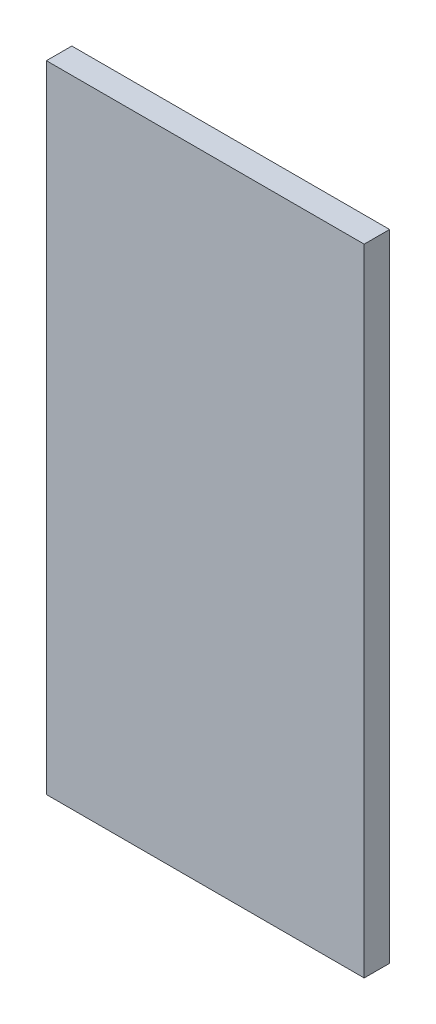
ISO-10303-21;
HEADER;
FILE_DESCRIPTION(('STEP AP214'),'2;1');
FILE_NAME('part.step','',(''),(''),'','','');
FILE_SCHEMA(('AUTOMOTIVE_DESIGN { 1 0 10303 214 1 1 1 1 }'));
ENDSEC;
DATA;
#1=APPLICATION_CONTEXT('core data for automotive mechanical design processes');
#2=APPLICATION_PROTOCOL_DEFINITION('international standard','automotive_design',2000,#1);
#3=PRODUCT_CONTEXT('',#1,'mechanical');
#4=PRODUCT('Part','Part','',(#3));
#5=PRODUCT_RELATED_PRODUCT_CATEGORY('part','',(#4));
#6=PRODUCT_DEFINITION_FORMATION('','',#4);
#7=PRODUCT_DEFINITION_CONTEXT('part definition',#1,'design');
#8=PRODUCT_DEFINITION('design','',#6,#7);
#9=PRODUCT_DEFINITION_SHAPE('','',#8);
#10=(LENGTH_UNIT() NAMED_UNIT(*) SI_UNIT(.MILLI.,.METRE.));
#11=(NAMED_UNIT(*) PLANE_ANGLE_UNIT() SI_UNIT($,.RADIAN.));
#12=(NAMED_UNIT(*) SI_UNIT($,.STERADIAN.) SOLID_ANGLE_UNIT());
#13=UNCERTAINTY_MEASURE_WITH_UNIT(LENGTH_MEASURE(1.E-05),#10,'distance_accuracy_value','');
#14=(GEOMETRIC_REPRESENTATION_CONTEXT(3) GLOBAL_UNCERTAINTY_ASSIGNED_CONTEXT((#13)) GLOBAL_UNIT_ASSIGNED_CONTEXT((#10,
#11,#12)) REPRESENTATION_CONTEXT('',''));
#15=CARTESIAN_POINT('',(0.,0.,0.));
#16=DIRECTION('',(0.,0.,1.));
#17=DIRECTION('',(1.,0.,0.));
#18=AXIS2_PLACEMENT_3D('',#15,#16,#17);
#19=CARTESIAN_POINT('',(0.,0.,7.));
#20=DIRECTION('',(0.,0.,-1.));
#21=DIRECTION('',(-1.,0.,0.));
#22=AXIS2_PLACEMENT_3D('',#19,#20,#21);
#23=TOROIDAL_SURFACE('',#22,41.,1.);
#24=CARTESIAN_POINT('',(0.,0.,8.));
#25=DIRECTION('',(0.,0.,-1.));
#26=DIRECTION('',(-1.,0.,0.));
#27=AXIS2_PLACEMENT_3D('',#24,#25,#26);
#28=CIRCLE('',#27,41.);
#29=CARTESIAN_POINT('',(-41.,0.,8.));
#30=VERTEX_POINT('',#29);
#31=EDGE_CURVE('E45',#30,#30,#28,.F.);
#32=ORIENTED_EDGE('',*,*,#31,.F.);
#33=EDGE_LOOP('',(#32));
#34=FACE_BOUND('',#33,.T.);
#35=CARTESIAN_POINT('',(0.,0.,7.));
#36=DIRECTION('',(0.,0.,-1.));
#37=DIRECTION('',(-1.,0.,0.));
#38=AXIS2_PLACEMENT_3D('',#35,#36,#37);
#39=CIRCLE('',#38,40.);
#40=CARTESIAN_POINT('',(-40.,0.,7.));
#41=VERTEX_POINT('',#40);
#42=EDGE_CURVE('E11',#41,#41,#39,.T.);
#43=ORIENTED_EDGE('',*,*,#42,.F.);
#44=EDGE_LOOP('',(#43));
#45=FACE_BOUND('',#44,.T.);
#46=ADVANCED_FACE('F37',(#34,#45),#23,.F.);
#47=CARTESIAN_POINT('',(0.,0.,1.5));
#48=DIRECTION('',(0.,0.,-1.));
#49=DIRECTION('',(-1.,0.,0.));
#50=AXIS2_PLACEMENT_3D('',#47,#48,#49);
#51=CYLINDRICAL_SURFACE('',#50,17.5);
#52=CARTESIAN_POINT('',(0.,0.,1.5));
#53=DIRECTION('',(0.,0.,1.));
#54=DIRECTION('',(1.,0.,0.));
#55=AXIS2_PLACEMENT_3D('',#52,#53,#54);
#56=CIRCLE('',#55,17.5);
#57=CARTESIAN_POINT('',(17.5,0.,1.5));
#58=VERTEX_POINT('',#57);
#59=EDGE_CURVE('E119',#58,#58,#56,.T.);
#60=ORIENTED_EDGE('',*,*,#59,.F.);
#61=EDGE_LOOP('',(#60));
#62=FACE_BOUND('',#61,.T.);
#63=CARTESIAN_POINT('',(0.,0.,0.));
#64=DIRECTION('',(0.,0.,1.));
#65=DIRECTION('',(1.,0.,0.));
#66=AXIS2_PLACEMENT_3D('',#63,#64,#65);
#67=CIRCLE('',#66,17.5);
#68=CARTESIAN_POINT('',(17.5,0.,0.));
#69=VERTEX_POINT('',#68);
#70=EDGE_CURVE('E118',#69,#69,#67,.T.);
#71=ORIENTED_EDGE('',*,*,#70,.T.);
#72=EDGE_LOOP('',(#71));
#73=FACE_BOUND('',#72,.T.);
#74=ADVANCED_FACE('F131',(#62,#73),#51,.T.);
#75=CARTESIAN_POINT('',(0.,0.,0.));
#76=DIRECTION('',(0.,0.,1.));
#77=DIRECTION('',(1.,0.,0.));
#78=AXIS2_PLACEMENT_3D('',#75,#76,#77);
#79=PLANE('',#78);
#80=ORIENTED_EDGE('',*,*,#70,.F.);
#81=EDGE_LOOP('',(#80));
#82=FACE_BOUND('',#81,.T.);
#83=ADVANCED_FACE('F138',(#82),#79,.F.);
#84=CARTESIAN_POINT('',(0.,0.,8.));
#85=DIRECTION('',(0.,0.,-1.));
#86=DIRECTION('',(-1.,0.,0.));
#87=AXIS2_PLACEMENT_3D('',#84,#85,#86);
#88=CYLINDRICAL_SURFACE('',#87,40.);
#89=CARTESIAN_POINT('',(0.,0.,1.5));
#90=DIRECTION('',(0.,0.,1.));
#91=DIRECTION('',(1.,0.,0.));
#92=AXIS2_PLACEMENT_3D('',#89,#90,#91);
#93=CIRCLE('',#92,40.);
#94=CARTESIAN_POINT('',(-40.,0.,1.5));
#95=VERTEX_POINT('',#94);
#96=EDGE_CURVE('E113',#95,#95,#93,.T.);
#97=CARTESIAN_POINT('',(-40.,0.,7.));
#98=CARTESIAN_POINT('',(-40.,0.,6.94270833333333));
#99=CARTESIAN_POINT('',(-40.,0.,6.88541666666667));
#100=CARTESIAN_POINT('',(-40.,0.,6.77083333333333));
#101=CARTESIAN_POINT('',(-40.,0.,6.71354166666667));
#102=CARTESIAN_POINT('',(-40.,0.,6.59895833333333));
#103=CARTESIAN_POINT('',(-40.,0.,6.54166666666667));
#104=CARTESIAN_POINT('',(-40.,0.,6.42708333333333));
#105=CARTESIAN_POINT('',(-40.,0.,6.36979166666667));
#106=CARTESIAN_POINT('',(-40.,0.,6.25520833333333));
#107=CARTESIAN_POINT('',(-40.,0.,6.19791666666667));
#108=CARTESIAN_POINT('',(-40.,0.,6.08333333333333));
#109=CARTESIAN_POINT('',(-40.,0.,6.02604166666667));
#110=CARTESIAN_POINT('',(-40.,0.,5.91145833333333));
#111=CARTESIAN_POINT('',(-40.,0.,5.85416666666667));
#112=CARTESIAN_POINT('',(-40.,0.,5.73958333333333));
#113=CARTESIAN_POINT('',(-40.,0.,5.68229166666667));
#114=CARTESIAN_POINT('',(-40.,0.,5.56770833333333));
#115=CARTESIAN_POINT('',(-40.,0.,5.51041666666667));
#116=CARTESIAN_POINT('',(-40.,0.,5.39583333333333));
#117=CARTESIAN_POINT('',(-40.,0.,5.33854166666667));
#118=CARTESIAN_POINT('',(-40.,0.,5.22395833333333));
#119=CARTESIAN_POINT('',(-40.,0.,5.16666666666667));
#120=CARTESIAN_POINT('',(-40.,0.,5.05208333333333));
#121=CARTESIAN_POINT('',(-40.,0.,4.99479166666667));
#122=CARTESIAN_POINT('',(-40.,0.,4.88020833333333));
#123=CARTESIAN_POINT('',(-40.,0.,4.82291666666667));
#124=CARTESIAN_POINT('',(-40.,0.,4.70833333333333));
#125=CARTESIAN_POINT('',(-40.,0.,4.65104166666667));
#126=CARTESIAN_POINT('',(-40.,0.,4.53645833333333));
#127=CARTESIAN_POINT('',(-40.,0.,4.47916666666667));
#128=CARTESIAN_POINT('',(-40.,0.,4.36458333333333));
#129=CARTESIAN_POINT('',(-40.,0.,4.30729166666667));
#130=CARTESIAN_POINT('',(-40.,0.,4.19270833333333));
#131=CARTESIAN_POINT('',(-40.,0.,4.13541666666667));
#132=CARTESIAN_POINT('',(-40.,0.,4.02083333333333));
#133=CARTESIAN_POINT('',(-40.,0.,3.96354166666667));
#134=CARTESIAN_POINT('',(-40.,0.,3.84895833333333));
#135=CARTESIAN_POINT('',(-40.,0.,3.79166666666667));
#136=CARTESIAN_POINT('',(-40.,0.,3.67708333333333));
#137=CARTESIAN_POINT('',(-40.,0.,3.61979166666667));
#138=CARTESIAN_POINT('',(-40.,0.,3.50520833333333));
#139=CARTESIAN_POINT('',(-40.,0.,3.44791666666667));
#140=CARTESIAN_POINT('',(-40.,0.,3.33333333333333));
#141=CARTESIAN_POINT('',(-40.,0.,3.27604166666667));
#142=CARTESIAN_POINT('',(-40.,0.,3.16145833333333));
#143=CARTESIAN_POINT('',(-40.,0.,3.10416666666667));
#144=CARTESIAN_POINT('',(-40.,0.,2.98958333333333));
#145=CARTESIAN_POINT('',(-40.,0.,2.93229166666667));
#146=CARTESIAN_POINT('',(-40.,0.,2.81770833333333));
#147=CARTESIAN_POINT('',(-40.,0.,2.76041666666667));
#148=CARTESIAN_POINT('',(-40.,0.,2.64583333333333));
#149=CARTESIAN_POINT('',(-40.,0.,2.58854166666667));
#150=CARTESIAN_POINT('',(-40.,0.,2.47395833333333));
#151=CARTESIAN_POINT('',(-40.,0.,2.41666666666667));
#152=CARTESIAN_POINT('',(-40.,0.,2.30208333333333));
#153=CARTESIAN_POINT('',(-40.,0.,2.24479166666667));
#154=CARTESIAN_POINT('',(-40.,0.,2.13020833333333));
#155=CARTESIAN_POINT('',(-40.,0.,2.07291666666667));
#156=CARTESIAN_POINT('',(-40.,0.,1.95833333333333));
#157=CARTESIAN_POINT('',(-40.,0.,1.90104166666667));
#158=CARTESIAN_POINT('',(-40.,0.,1.78645833333333));
#159=CARTESIAN_POINT('',(-40.,0.,1.72916666666667));
#160=CARTESIAN_POINT('',(-40.,0.,1.61458333333333));
#161=CARTESIAN_POINT('',(-40.,0.,1.55729166666667));
#162=CARTESIAN_POINT('',(-40.,0.,1.5));
#163=B_SPLINE_CURVE_WITH_KNOTS('',3,(#97,#98,#99,#100,#101,#102,#103,#104,#105,#106,#107,#108,
#109,#110,#111,#112,#113,#114,#115,#116,#117,#118,#119,#120,#121,#122,#123,#124,#125,#126,#127,
#128,#129,#130,#131,#132,#133,#134,#135,#136,#137,#138,#139,#140,#141,#142,#143,#144,#145,#146,
#147,#148,#149,#150,#151,#152,#153,#154,#155,#156,#157,#158,#159,#160,#161,#162),.UNSPECIFIED.,
.F.,.F.,(4,2,2,2,2,2,2,2,2,2,2,2,2,2,2,2,2,2,2,2,2,2,2,2,2,2,2,2,2,2,2,2,4),(0.,
0.171874999999999,0.343749999999999,0.515625,0.6875,0.859375,1.03125,1.203125,1.375,1.546875,
1.71875,1.890625,2.0625,2.234375,2.40625,2.578125,2.75,2.921875,3.09375,3.265625,3.4375,
3.609375,3.78125,3.953125,4.125,4.296875,4.46875,4.640625,4.8125,4.984375,5.15625,5.328125,5.5),.UNSPECIFIED.);
#164=EDGE_CURVE('BSEAM134',#41,#95,#163,.T.);
#165=ORIENTED_EDGE('',*,*,#42,.T.);
#166=ORIENTED_EDGE('',*,*,#96,.T.);
#167=ORIENTED_EDGE('',*,*,#164,.T.);
#168=ORIENTED_EDGE('',*,*,#164,.F.);
#169=EDGE_LOOP('',(#165,#167,#166,#168));
#170=FACE_BOUND('',#169,.T.);
#171=ADVANCED_FACE('F134',(#170),#88,.T.);
#172=CARTESIAN_POINT('',(0.,0.,1.5));
#173=DIRECTION('',(0.,0.,1.));
#174=DIRECTION('',(1.,0.,0.));
#175=AXIS2_PLACEMENT_3D('',#172,#173,#174);
#176=PLANE('',#175);
#177=ORIENTED_EDGE('',*,*,#59,.T.);
#178=EDGE_LOOP('',(#177));
#179=FACE_BOUND('',#178,.T.);
#180=ORIENTED_EDGE('',*,*,#96,.F.);
#181=EDGE_LOOP('',(#180));
#182=FACE_BOUND('',#181,.T.);
#183=ADVANCED_FACE('F137',(#179,#182),#176,.F.);
#184=CARTESIAN_POINT('',(-125.,-250.,28.));
#185=DIRECTION('',(-1.,0.,0.));
#186=DIRECTION('',(0.,0.,1.));
#187=AXIS2_PLACEMENT_3D('',#184,#185,#186);
#188=PLANE('',#187);
#189=DIRECTION('',(0.,1.,0.));
#190=VECTOR('',#189,1.);
#191=CARTESIAN_POINT('',(-125.,-250.,8.));
#192=LINE('',#191,#190);
#193=CARTESIAN_POINT('',(-125.,-250.,8.));
#194=VERTEX_POINT('',#193);
#195=CARTESIAN_POINT('',(-125.,250.,8.));
#196=VERTEX_POINT('',#195);
#197=EDGE_CURVE('E105',#194,#196,#192,.T.);
#198=ORIENTED_EDGE('',*,*,#197,.F.);
#199=DIRECTION('',(0.,0.,-1.));
#200=VECTOR('',#199,1.);
#201=CARTESIAN_POINT('',(-125.,-250.,28.));
#202=LINE('',#201,#200);
#203=CARTESIAN_POINT('',(-125.,-250.,28.));
#204=VERTEX_POINT('',#203);
#205=EDGE_CURVE('E53',#204,#194,#202,.T.);
#206=ORIENTED_EDGE('',*,*,#205,.F.);
#207=DIRECTION('',(0.,1.,0.));
#208=VECTOR('',#207,1.);
#209=CARTESIAN_POINT('',(-125.,-250.,28.));
#210=LINE('',#209,#208);
#211=CARTESIAN_POINT('',(-125.,250.,28.));
#212=VERTEX_POINT('',#211);
#213=EDGE_CURVE('E100',#204,#212,#210,.T.);
#214=ORIENTED_EDGE('',*,*,#213,.T.);
#215=DIRECTION('',(0.,0.,-1.));
#216=VECTOR('',#215,1.);
#217=CARTESIAN_POINT('',(-125.,250.,28.));
#218=LINE('',#217,#216);
#219=EDGE_CURVE('E78',#212,#196,#218,.T.);
#220=ORIENTED_EDGE('',*,*,#219,.T.);
#221=EDGE_LOOP('',(#198,#206,#214,#220));
#222=FACE_BOUND('',#221,.T.);
#223=ADVANCED_FACE('F143',(#222),#188,.T.);
#224=CARTESIAN_POINT('',(-125.,-250.,28.));
#225=DIRECTION('',(0.,1.,0.));
#226=DIRECTION('',(0.,0.,1.));
#227=AXIS2_PLACEMENT_3D('',#224,#225,#226);
#228=PLANE('',#227);
#229=DIRECTION('',(1.,0.,0.));
#230=VECTOR('',#229,1.);
#231=CARTESIAN_POINT('',(-125.,-250.,8.));
#232=LINE('',#231,#230);
#233=CARTESIAN_POINT('',(125.,-250.,8.));
#234=VERTEX_POINT('',#233);
#235=EDGE_CURVE('E70',#194,#234,#232,.T.);
#236=ORIENTED_EDGE('',*,*,#235,.T.);
#237=DIRECTION('',(0.,0.,-1.));
#238=VECTOR('',#237,1.);
#239=CARTESIAN_POINT('',(125.,-250.,28.));
#240=LINE('',#239,#238);
#241=CARTESIAN_POINT('',(125.,-250.,28.));
#242=VERTEX_POINT('',#241);
#243=EDGE_CURVE('E97',#242,#234,#240,.T.);
#244=ORIENTED_EDGE('',*,*,#243,.F.);
#245=DIRECTION('',(1.,0.,0.));
#246=VECTOR('',#245,1.);
#247=CARTESIAN_POINT('',(-125.,-250.,28.));
#248=LINE('',#247,#246);
#249=EDGE_CURVE('E88',#204,#242,#248,.T.);
#250=ORIENTED_EDGE('',*,*,#249,.F.);
#251=ORIENTED_EDGE('',*,*,#205,.T.);
#252=EDGE_LOOP('',(#236,#244,#250,#251));
#253=FACE_BOUND('',#252,.T.);
#254=ADVANCED_FACE('F149',(#253),#228,.F.);
#255=CARTESIAN_POINT('',(125.,-250.,28.));
#256=DIRECTION('',(-1.,0.,0.));
#257=DIRECTION('',(0.,0.,1.));
#258=AXIS2_PLACEMENT_3D('',#255,#256,#257);
#259=PLANE('',#258);
#260=DIRECTION('',(0.,1.,0.));
#261=VECTOR('',#260,1.);
#262=CARTESIAN_POINT('',(125.,-250.,8.));
#263=LINE('',#262,#261);
#264=CARTESIAN_POINT('',(125.,250.,8.));
#265=VERTEX_POINT('',#264);
#266=EDGE_CURVE('E95',#234,#265,#263,.T.);
#267=ORIENTED_EDGE('',*,*,#266,.T.);
#268=DIRECTION('',(0.,0.,-1.));
#269=VECTOR('',#268,1.);
#270=CARTESIAN_POINT('',(125.,250.,28.));
#271=LINE('',#270,#269);
#272=CARTESIAN_POINT('',(125.,250.,28.));
#273=VERTEX_POINT('',#272);
#274=EDGE_CURVE('E92',#273,#265,#271,.T.);
#275=ORIENTED_EDGE('',*,*,#274,.F.);
#276=DIRECTION('',(0.,1.,0.));
#277=VECTOR('',#276,1.);
#278=CARTESIAN_POINT('',(125.,-250.,28.));
#279=LINE('',#278,#277);
#280=EDGE_CURVE('E83',#242,#273,#279,.T.);
#281=ORIENTED_EDGE('',*,*,#280,.F.);
#282=ORIENTED_EDGE('',*,*,#243,.T.);
#283=EDGE_LOOP('',(#267,#275,#281,#282));
#284=FACE_BOUND('',#283,.T.);
#285=ADVANCED_FACE('F93',(#284),#259,.F.);
#286=CARTESIAN_POINT('',(-125.,250.,28.));
#287=DIRECTION('',(0.,1.,0.));
#288=DIRECTION('',(0.,0.,1.));
#289=AXIS2_PLACEMENT_3D('',#286,#287,#288);
#290=PLANE('',#289);
#291=DIRECTION('',(1.,0.,0.));
#292=VECTOR('',#291,1.);
#293=CARTESIAN_POINT('',(-125.,250.,8.));
#294=LINE('',#293,#292);
#295=EDGE_CURVE('E108',#196,#265,#294,.T.);
#296=ORIENTED_EDGE('',*,*,#295,.F.);
#297=ORIENTED_EDGE('',*,*,#219,.F.);
#298=DIRECTION('',(1.,0.,0.));
#299=VECTOR('',#298,1.);
#300=CARTESIAN_POINT('',(-125.,250.,28.));
#301=LINE('',#300,#299);
#302=EDGE_CURVE('E87',#212,#273,#301,.T.);
#303=ORIENTED_EDGE('',*,*,#302,.T.);
#304=ORIENTED_EDGE('',*,*,#274,.T.);
#305=EDGE_LOOP('',(#296,#297,#303,#304));
#306=FACE_BOUND('',#305,.T.);
#307=ADVANCED_FACE('F99',(#306),#290,.T.);
#308=CARTESIAN_POINT('',(0.,0.,28.));
#309=DIRECTION('',(0.,0.,-1.));
#310=DIRECTION('',(-1.,0.,0.));
#311=AXIS2_PLACEMENT_3D('',#308,#309,#310);
#312=PLANE('',#311);
#313=ORIENTED_EDGE('',*,*,#213,.F.);
#314=ORIENTED_EDGE('',*,*,#249,.T.);
#315=ORIENTED_EDGE('',*,*,#280,.T.);
#316=ORIENTED_EDGE('',*,*,#302,.F.);
#317=EDGE_LOOP('',(#313,#314,#315,#316));
#318=FACE_BOUND('',#317,.T.);
#319=ADVANCED_FACE('F86',(#318),#312,.F.);
#320=CARTESIAN_POINT('',(0.,0.,8.));
#321=DIRECTION('',(0.,0.,-1.));
#322=DIRECTION('',(-1.,0.,0.));
#323=AXIS2_PLACEMENT_3D('',#320,#321,#322);
#324=PLANE('',#323);
#325=ORIENTED_EDGE('',*,*,#31,.T.);
#326=EDGE_LOOP('',(#325));
#327=FACE_BOUND('',#326,.T.);
#328=ORIENTED_EDGE('',*,*,#197,.T.);
#329=ORIENTED_EDGE('',*,*,#295,.T.);
#330=ORIENTED_EDGE('',*,*,#266,.F.);
#331=ORIENTED_EDGE('',*,*,#235,.F.);
#332=EDGE_LOOP('',(#328,#329,#330,#331));
#333=FACE_BOUND('',#332,.T.);
#334=ADVANCED_FACE('F126',(#327,#333),#324,.T.);
#335=CLOSED_SHELL('',(#46,#74,#83,#171,#183,#223,#254,#285,#307,#319,#334));
#336=MANIFOLD_SOLID_BREP('B2',#335);
#337=ADVANCED_BREP_SHAPE_REPRESENTATION('',(#18,#336),#14);
#338=SHAPE_DEFINITION_REPRESENTATION(#9,#337);
ENDSEC;
END-ISO-10303-21;
